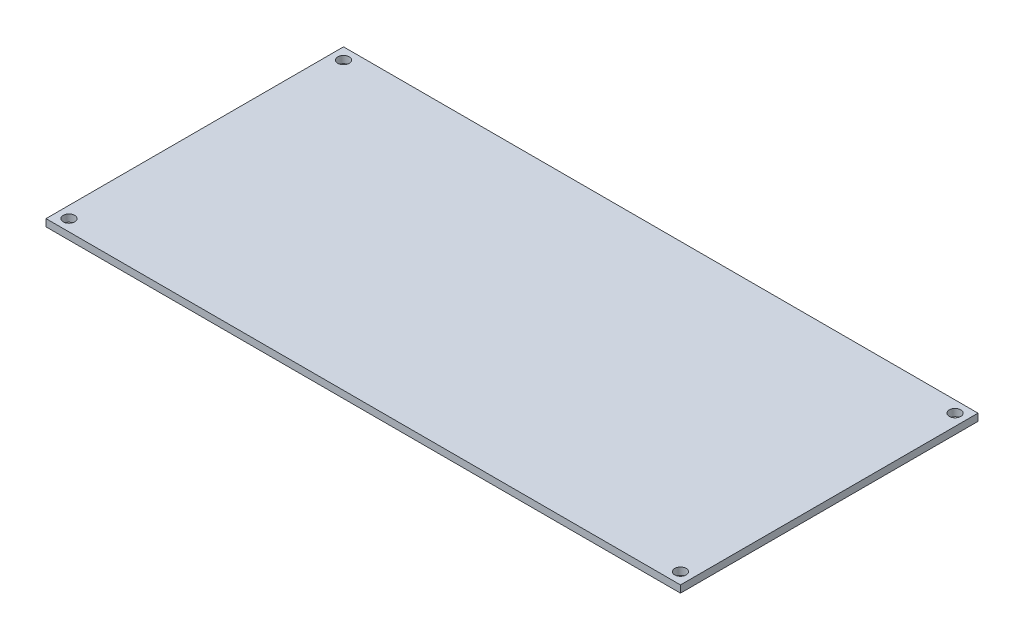
ISO-10303-21;
HEADER;
FILE_DESCRIPTION(('STEP AP214'),'2;1');
FILE_NAME('part.step','',(''),(''),'','','');
FILE_SCHEMA(('AUTOMOTIVE_DESIGN { 1 0 10303 214 1 1 1 1 }'));
ENDSEC;
DATA;
#1=APPLICATION_CONTEXT('core data for automotive mechanical design processes');
#2=APPLICATION_PROTOCOL_DEFINITION('international standard','automotive_design',2000,#1);
#3=PRODUCT_CONTEXT('',#1,'mechanical');
#4=PRODUCT('Part','Part','',(#3));
#5=PRODUCT_RELATED_PRODUCT_CATEGORY('part','',(#4));
#6=PRODUCT_DEFINITION_FORMATION('','',#4);
#7=PRODUCT_DEFINITION_CONTEXT('part definition',#1,'design');
#8=PRODUCT_DEFINITION('design','',#6,#7);
#9=PRODUCT_DEFINITION_SHAPE('','',#8);
#10=(LENGTH_UNIT() NAMED_UNIT(*) SI_UNIT(.MILLI.,.METRE.));
#11=(NAMED_UNIT(*) PLANE_ANGLE_UNIT() SI_UNIT($,.RADIAN.));
#12=(NAMED_UNIT(*) SI_UNIT($,.STERADIAN.) SOLID_ANGLE_UNIT());
#13=UNCERTAINTY_MEASURE_WITH_UNIT(LENGTH_MEASURE(1.E-05),#10,'distance_accuracy_value','');
#14=(GEOMETRIC_REPRESENTATION_CONTEXT(3) GLOBAL_UNCERTAINTY_ASSIGNED_CONTEXT((#13)) GLOBAL_UNIT_ASSIGNED_CONTEXT((#10,
#11,#12)) REPRESENTATION_CONTEXT('',''));
#15=CARTESIAN_POINT('',(0.,0.,0.));
#16=DIRECTION('',(0.,0.,1.));
#17=DIRECTION('',(1.,0.,0.));
#18=AXIS2_PLACEMENT_3D('',#15,#16,#17);
#19=CARTESIAN_POINT('',(0.,2.,0.));
#20=DIRECTION('',(1.,0.,0.));
#21=DIRECTION('',(0.,0.,-1.));
#22=AXIS2_PLACEMENT_3D('',#19,#20,#21);
#23=PLANE('',#22);
#24=DIRECTION('',(0.,0.,1.));
#25=VECTOR('',#24,1.);
#26=CARTESIAN_POINT('',(0.,0.,0.));
#27=LINE('',#26,#25);
#28=CARTESIAN_POINT('',(0.,0.,0.));
#29=VERTEX_POINT('',#28);
#30=CARTESIAN_POINT('',(0.,0.,83.));
#31=VERTEX_POINT('',#30);
#32=EDGE_CURVE('E95',#29,#31,#27,.T.);
#33=ORIENTED_EDGE('',*,*,#32,.T.);
#34=DIRECTION('',(0.,-1.,0.));
#35=VECTOR('',#34,1.);
#36=CARTESIAN_POINT('',(0.,2.,83.));
#37=LINE('',#36,#35);
#38=CARTESIAN_POINT('',(0.,2.,83.));
#39=VERTEX_POINT('',#38);
#40=EDGE_CURVE('E11',#39,#31,#37,.T.);
#41=ORIENTED_EDGE('',*,*,#40,.F.);
#42=DIRECTION('',(0.,0.,1.));
#43=VECTOR('',#42,1.);
#44=CARTESIAN_POINT('',(0.,2.,0.));
#45=LINE('',#44,#43);
#46=CARTESIAN_POINT('',(0.,2.,0.));
#47=VERTEX_POINT('',#46);
#48=EDGE_CURVE('E83',#47,#39,#45,.T.);
#49=ORIENTED_EDGE('',*,*,#48,.F.);
#50=DIRECTION('',(0.,-1.,0.));
#51=VECTOR('',#50,1.);
#52=CARTESIAN_POINT('',(0.,2.,0.));
#53=LINE('',#52,#51);
#54=EDGE_CURVE('E91',#47,#29,#53,.T.);
#55=ORIENTED_EDGE('',*,*,#54,.T.);
#56=EDGE_LOOP('',(#33,#41,#49,#55));
#57=FACE_BOUND('',#56,.T.);
#58=ADVANCED_FACE('F32',(#57),#23,.F.);
#59=CARTESIAN_POINT('',(0.,2.,83.));
#60=DIRECTION('',(0.,0.,-1.));
#61=DIRECTION('',(-1.,0.,0.));
#62=AXIS2_PLACEMENT_3D('',#59,#60,#61);
#63=PLANE('',#62);
#64=DIRECTION('',(1.,0.,0.));
#65=VECTOR('',#64,1.);
#66=CARTESIAN_POINT('',(0.,0.,83.));
#67=LINE('',#66,#65);
#68=CARTESIAN_POINT('',(177.,0.,83.));
#69=VERTEX_POINT('',#68);
#70=EDGE_CURVE('E87',#31,#69,#67,.T.);
#71=ORIENTED_EDGE('',*,*,#70,.T.);
#72=DIRECTION('',(0.,-1.,0.));
#73=VECTOR('',#72,1.);
#74=CARTESIAN_POINT('',(177.,2.,83.));
#75=LINE('',#74,#73);
#76=CARTESIAN_POINT('',(177.,2.,83.));
#77=VERTEX_POINT('',#76);
#78=EDGE_CURVE('E40',#77,#69,#75,.T.);
#79=ORIENTED_EDGE('',*,*,#78,.F.);
#80=DIRECTION('',(1.,0.,0.));
#81=VECTOR('',#80,1.);
#82=CARTESIAN_POINT('',(0.,2.,83.));
#83=LINE('',#82,#81);
#84=EDGE_CURVE('E78',#39,#77,#83,.T.);
#85=ORIENTED_EDGE('',*,*,#84,.F.);
#86=ORIENTED_EDGE('',*,*,#40,.T.);
#87=EDGE_LOOP('',(#71,#79,#85,#86));
#88=FACE_BOUND('',#87,.T.);
#89=ADVANCED_FACE('F86',(#88),#63,.F.);
#90=CARTESIAN_POINT('',(177.,2.,0.));
#91=DIRECTION('',(-1.,0.,0.));
#92=DIRECTION('',(0.,0.,1.));
#93=AXIS2_PLACEMENT_3D('',#90,#91,#92);
#94=PLANE('',#93);
#95=DIRECTION('',(0.,0.,-1.));
#96=VECTOR('',#95,1.);
#97=CARTESIAN_POINT('',(177.,0.,0.));
#98=LINE('',#97,#96);
#99=CARTESIAN_POINT('',(177.,0.,0.));
#100=VERTEX_POINT('',#99);
#101=EDGE_CURVE('E65',#69,#100,#98,.T.);
#102=ORIENTED_EDGE('',*,*,#101,.T.);
#103=DIRECTION('',(0.,-1.,0.));
#104=VECTOR('',#103,1.);
#105=CARTESIAN_POINT('',(177.,2.,0.));
#106=LINE('',#105,#104);
#107=CARTESIAN_POINT('',(177.,2.,0.));
#108=VERTEX_POINT('',#107);
#109=EDGE_CURVE('E88',#108,#100,#106,.T.);
#110=ORIENTED_EDGE('',*,*,#109,.F.);
#111=DIRECTION('',(0.,0.,-1.));
#112=VECTOR('',#111,1.);
#113=CARTESIAN_POINT('',(177.,2.,0.));
#114=LINE('',#113,#112);
#115=EDGE_CURVE('E81',#77,#108,#114,.T.);
#116=ORIENTED_EDGE('',*,*,#115,.F.);
#117=ORIENTED_EDGE('',*,*,#78,.T.);
#118=EDGE_LOOP('',(#102,#110,#116,#117));
#119=FACE_BOUND('',#118,.T.);
#120=ADVANCED_FACE('F89',(#119),#94,.F.);
#121=CARTESIAN_POINT('',(0.,2.,0.));
#122=DIRECTION('',(0.,0.,1.));
#123=DIRECTION('',(1.,0.,0.));
#124=AXIS2_PLACEMENT_3D('',#121,#122,#123);
#125=PLANE('',#124);
#126=DIRECTION('',(-1.,0.,0.));
#127=VECTOR('',#126,1.);
#128=CARTESIAN_POINT('',(0.,0.,0.));
#129=LINE('',#128,#127);
#130=EDGE_CURVE('E71',#100,#29,#129,.T.);
#131=ORIENTED_EDGE('',*,*,#130,.T.);
#132=ORIENTED_EDGE('',*,*,#54,.F.);
#133=DIRECTION('',(-1.,0.,0.));
#134=VECTOR('',#133,1.);
#135=CARTESIAN_POINT('',(0.,2.,0.));
#136=LINE('',#135,#134);
#137=EDGE_CURVE('E48',#108,#47,#136,.T.);
#138=ORIENTED_EDGE('',*,*,#137,.F.);
#139=ORIENTED_EDGE('',*,*,#109,.T.);
#140=EDGE_LOOP('',(#131,#132,#138,#139));
#141=FACE_BOUND('',#140,.T.);
#142=ADVANCED_FACE('F103',(#141),#125,.F.);
#143=CARTESIAN_POINT('',(0.,2.,0.));
#144=DIRECTION('',(0.,1.,0.));
#145=DIRECTION('',(0.,0.,1.));
#146=AXIS2_PLACEMENT_3D('',#143,#144,#145);
#147=PLANE('',#146);
#148=CARTESIAN_POINT('',(3.2,2.,79.8));
#149=DIRECTION('',(0.,1.,0.));
#150=DIRECTION('',(0.,0.,1.));
#151=AXIS2_PLACEMENT_3D('',#148,#149,#150);
#152=CIRCLE('',#151,1.6);
#153=CARTESIAN_POINT('',(3.2,2.,81.4));
#154=VERTEX_POINT('',#153);
#155=EDGE_CURVE('E118',#154,#154,#152,.T.);
#156=ORIENTED_EDGE('',*,*,#155,.F.);
#157=EDGE_LOOP('',(#156));
#158=FACE_BOUND('',#157,.T.);
#159=CARTESIAN_POINT('',(173.8,2.,3.2));
#160=DIRECTION('',(0.,1.,0.));
#161=DIRECTION('',(0.,0.,1.));
#162=AXIS2_PLACEMENT_3D('',#159,#160,#161);
#163=CIRCLE('',#162,1.59999999999999);
#164=CARTESIAN_POINT('',(173.8,2.,4.79999999999999));
#165=VERTEX_POINT('',#164);
#166=EDGE_CURVE('E119',#165,#165,#163,.T.);
#167=ORIENTED_EDGE('',*,*,#166,.F.);
#168=EDGE_LOOP('',(#167));
#169=FACE_BOUND('',#168,.T.);
#170=CARTESIAN_POINT('',(173.8,2.,79.8));
#171=DIRECTION('',(0.,1.,0.));
#172=DIRECTION('',(0.,0.,1.));
#173=AXIS2_PLACEMENT_3D('',#170,#171,#172);
#174=CIRCLE('',#173,1.59999999999999);
#175=CARTESIAN_POINT('',(173.8,2.,81.4));
#176=VERTEX_POINT('',#175);
#177=EDGE_CURVE('E129',#176,#176,#174,.T.);
#178=ORIENTED_EDGE('',*,*,#177,.F.);
#179=EDGE_LOOP('',(#178));
#180=FACE_BOUND('',#179,.T.);
#181=CARTESIAN_POINT('',(3.2,2.,3.2));
#182=DIRECTION('',(0.,1.,0.));
#183=DIRECTION('',(0.,0.,1.));
#184=AXIS2_PLACEMENT_3D('',#181,#182,#183);
#185=CIRCLE('',#184,1.6);
#186=CARTESIAN_POINT('',(3.2,2.,4.8));
#187=VERTEX_POINT('',#186);
#188=EDGE_CURVE('E111',#187,#187,#185,.T.);
#189=ORIENTED_EDGE('',*,*,#188,.F.);
#190=EDGE_LOOP('',(#189));
#191=FACE_BOUND('',#190,.T.);
#192=ORIENTED_EDGE('',*,*,#48,.T.);
#193=ORIENTED_EDGE('',*,*,#84,.T.);
#194=ORIENTED_EDGE('',*,*,#115,.T.);
#195=ORIENTED_EDGE('',*,*,#137,.T.);
#196=EDGE_LOOP('',(#192,#193,#194,#195));
#197=FACE_BOUND('',#196,.T.);
#198=ADVANCED_FACE('F79',(#158,#169,#180,#191,#197),#147,.T.);
#199=CARTESIAN_POINT('',(0.,0.,0.));
#200=DIRECTION('',(0.,1.,0.));
#201=DIRECTION('',(0.,0.,1.));
#202=AXIS2_PLACEMENT_3D('',#199,#200,#201);
#203=PLANE('',#202);
#204=CARTESIAN_POINT('',(3.2,0.,79.8));
#205=DIRECTION('',(0.,1.,0.));
#206=DIRECTION('',(0.,0.,1.));
#207=AXIS2_PLACEMENT_3D('',#204,#205,#206);
#208=CIRCLE('',#207,1.6);
#209=CARTESIAN_POINT('',(3.2,0.,81.4));
#210=VERTEX_POINT('',#209);
#211=EDGE_CURVE('E114',#210,#210,#208,.F.);
#212=ORIENTED_EDGE('',*,*,#211,.F.);
#213=EDGE_LOOP('',(#212));
#214=FACE_BOUND('',#213,.T.);
#215=CARTESIAN_POINT('',(173.8,0.,3.2));
#216=DIRECTION('',(0.,1.,0.));
#217=DIRECTION('',(0.,0.,1.));
#218=AXIS2_PLACEMENT_3D('',#215,#216,#217);
#219=CIRCLE('',#218,1.59999999999999);
#220=CARTESIAN_POINT('',(173.8,0.,4.79999999999999));
#221=VERTEX_POINT('',#220);
#222=EDGE_CURVE('E115',#221,#221,#219,.F.);
#223=ORIENTED_EDGE('',*,*,#222,.F.);
#224=EDGE_LOOP('',(#223));
#225=FACE_BOUND('',#224,.T.);
#226=CARTESIAN_POINT('',(173.8,0.,79.8));
#227=DIRECTION('',(0.,1.,0.));
#228=DIRECTION('',(0.,0.,1.));
#229=AXIS2_PLACEMENT_3D('',#226,#227,#228);
#230=CIRCLE('',#229,1.59999999999999);
#231=CARTESIAN_POINT('',(173.8,0.,81.4));
#232=VERTEX_POINT('',#231);
#233=EDGE_CURVE('E122',#232,#232,#230,.F.);
#234=ORIENTED_EDGE('',*,*,#233,.F.);
#235=EDGE_LOOP('',(#234));
#236=FACE_BOUND('',#235,.T.);
#237=CARTESIAN_POINT('',(3.2,0.,3.2));
#238=DIRECTION('',(0.,1.,0.));
#239=DIRECTION('',(0.,0.,1.));
#240=AXIS2_PLACEMENT_3D('',#237,#238,#239);
#241=CIRCLE('',#240,1.6);
#242=CARTESIAN_POINT('',(3.2,0.,4.8));
#243=VERTEX_POINT('',#242);
#244=EDGE_CURVE('E98',#243,#243,#241,.F.);
#245=ORIENTED_EDGE('',*,*,#244,.F.);
#246=EDGE_LOOP('',(#245));
#247=FACE_BOUND('',#246,.T.);
#248=ORIENTED_EDGE('',*,*,#32,.F.);
#249=ORIENTED_EDGE('',*,*,#130,.F.);
#250=ORIENTED_EDGE('',*,*,#101,.F.);
#251=ORIENTED_EDGE('',*,*,#70,.F.);
#252=EDGE_LOOP('',(#248,#249,#250,#251));
#253=FACE_BOUND('',#252,.T.);
#254=ADVANCED_FACE('F106',(#214,#225,#236,#247,#253),#203,.F.);
#255=CARTESIAN_POINT('',(3.2,-0.00100000000000013,3.2));
#256=DIRECTION('',(0.,1.,0.));
#257=DIRECTION('',(0.,0.,1.));
#258=AXIS2_PLACEMENT_3D('',#255,#256,#257);
#259=CYLINDRICAL_SURFACE('',#258,1.6);
#260=ORIENTED_EDGE('',*,*,#188,.T.);
#261=EDGE_LOOP('',(#260));
#262=FACE_BOUND('',#261,.T.);
#263=ORIENTED_EDGE('',*,*,#244,.T.);
#264=EDGE_LOOP('',(#263));
#265=FACE_BOUND('',#264,.T.);
#266=ADVANCED_FACE('F142',(#262,#265),#259,.F.);
#267=CARTESIAN_POINT('',(173.8,-0.00100000000000013,79.8));
#268=DIRECTION('',(0.,1.,0.));
#269=DIRECTION('',(0.,0.,1.));
#270=AXIS2_PLACEMENT_3D('',#267,#268,#269);
#271=CYLINDRICAL_SURFACE('',#270,1.59999999999999);
#272=ORIENTED_EDGE('',*,*,#177,.T.);
#273=EDGE_LOOP('',(#272));
#274=FACE_BOUND('',#273,.T.);
#275=ORIENTED_EDGE('',*,*,#233,.T.);
#276=EDGE_LOOP('',(#275));
#277=FACE_BOUND('',#276,.T.);
#278=ADVANCED_FACE('F133',(#274,#277),#271,.F.);
#279=CARTESIAN_POINT('',(173.8,-0.00100000000000013,3.2));
#280=DIRECTION('',(0.,1.,0.));
#281=DIRECTION('',(0.,0.,1.));
#282=AXIS2_PLACEMENT_3D('',#279,#280,#281);
#283=CYLINDRICAL_SURFACE('',#282,1.59999999999999);
#284=ORIENTED_EDGE('',*,*,#166,.T.);
#285=EDGE_LOOP('',(#284));
#286=FACE_BOUND('',#285,.T.);
#287=ORIENTED_EDGE('',*,*,#222,.T.);
#288=EDGE_LOOP('',(#287));
#289=FACE_BOUND('',#288,.T.);
#290=ADVANCED_FACE('F192',(#286,#289),#283,.F.);
#291=CARTESIAN_POINT('',(3.2,-0.00100000000000013,79.8));
#292=DIRECTION('',(0.,1.,0.));
#293=DIRECTION('',(0.,0.,1.));
#294=AXIS2_PLACEMENT_3D('',#291,#292,#293);
#295=CYLINDRICAL_SURFACE('',#294,1.6);
#296=ORIENTED_EDGE('',*,*,#155,.T.);
#297=EDGE_LOOP('',(#296));
#298=FACE_BOUND('',#297,.T.);
#299=ORIENTED_EDGE('',*,*,#211,.T.);
#300=EDGE_LOOP('',(#299));
#301=FACE_BOUND('',#300,.T.);
#302=ADVANCED_FACE('F201',(#298,#301),#295,.F.);
#303=CLOSED_SHELL('',(#58,#89,#120,#142,#198,#254,#266,#278,#290,#302));
#304=MANIFOLD_SOLID_BREP('B2',#303);
#305=ADVANCED_BREP_SHAPE_REPRESENTATION('',(#18,#304),#14);
#306=SHAPE_DEFINITION_REPRESENTATION(#9,#305);
ENDSEC;
END-ISO-10303-21;
